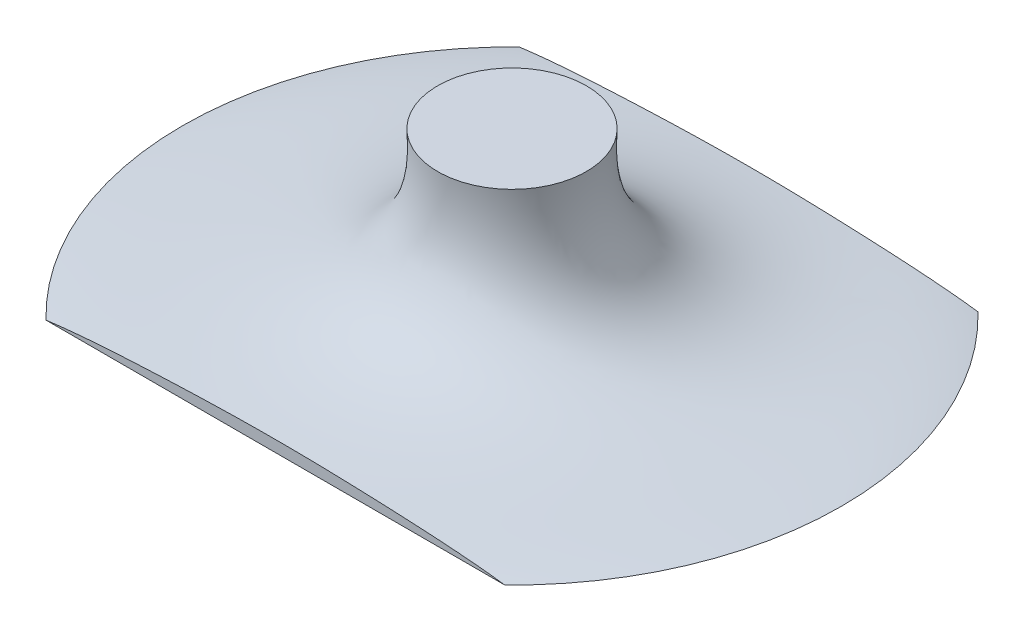
ISO-10303-21;
HEADER;
FILE_DESCRIPTION(('STEP AP214'),'2;1');
FILE_NAME('part.step','',(''),(''),'','','');
FILE_SCHEMA(('AUTOMOTIVE_DESIGN { 1 0 10303 214 1 1 1 1 }'));
ENDSEC;
DATA;
#1=APPLICATION_CONTEXT('core data for automotive mechanical design processes');
#2=APPLICATION_PROTOCOL_DEFINITION('international standard','automotive_design',2000,#1);
#3=PRODUCT_CONTEXT('',#1,'mechanical');
#4=PRODUCT('Part','Part','',(#3));
#5=PRODUCT_RELATED_PRODUCT_CATEGORY('part','',(#4));
#6=PRODUCT_DEFINITION_FORMATION('','',#4);
#7=PRODUCT_DEFINITION_CONTEXT('part definition',#1,'design');
#8=PRODUCT_DEFINITION('design','',#6,#7);
#9=PRODUCT_DEFINITION_SHAPE('','',#8);
#10=(LENGTH_UNIT() NAMED_UNIT(*) SI_UNIT(.MILLI.,.METRE.));
#11=(NAMED_UNIT(*) PLANE_ANGLE_UNIT() SI_UNIT($,.RADIAN.));
#12=(NAMED_UNIT(*) SI_UNIT($,.STERADIAN.) SOLID_ANGLE_UNIT());
#13=UNCERTAINTY_MEASURE_WITH_UNIT(LENGTH_MEASURE(1.E-05),#10,'distance_accuracy_value','');
#14=(GEOMETRIC_REPRESENTATION_CONTEXT(3) GLOBAL_UNCERTAINTY_ASSIGNED_CONTEXT((#13)) GLOBAL_UNIT_ASSIGNED_CONTEXT((#10,
#11,#12)) REPRESENTATION_CONTEXT('',''));
#15=CARTESIAN_POINT('',(0.,0.,0.));
#16=DIRECTION('',(0.,0.,1.));
#17=DIRECTION('',(1.,0.,0.));
#18=AXIS2_PLACEMENT_3D('',#15,#16,#17);
#19=CARTESIAN_POINT('',(97.5,-24.,0.));
#20=CARTESIAN_POINT('',(66.7018546066277,-17.9991049752791,0.));
#21=CARTESIAN_POINT('',(18.6369538432354,-25.1736024500448,0.));
#22=CARTESIAN_POINT('',(22.,24.,0.));
#23=B_SPLINE_CURVE_WITH_KNOTS('',3,(#19,#20,#21,#22),.UNSPECIFIED.,.F.,.F.,(4,4),(0.,1.),.UNSPECIFIED.);
#24=CARTESIAN_POINT('',(0.,-24.,0.));
#25=DIRECTION('',(0.,-1.,0.));
#26=AXIS1_PLACEMENT('',#24,#25);
#27=SURFACE_OF_REVOLUTION('',#23,#26);
#28=CARTESIAN_POINT('',(0.,24.,0.));
#29=DIRECTION('',(0.,-1.,0.));
#30=DIRECTION('',(0.,0.,-1.));
#31=AXIS2_PLACEMENT_3D('',#28,#29,#30);
#32=CIRCLE('',#31,22.);
#33=CARTESIAN_POINT('',(0.,24.,-22.));
#34=VERTEX_POINT('',#33);
#35=EDGE_CURVE('E71',#34,#34,#32,.T.);
#36=ORIENTED_EDGE('',*,*,#35,.T.);
#37=EDGE_LOOP('',(#36));
#38=FACE_BOUND('',#37,.T.);
#39=CARTESIAN_POINT('',(0.,-24.,0.));
#40=DIRECTION('',(0.,-1.,0.));
#41=DIRECTION('',(0.,0.,-1.));
#42=AXIS2_PLACEMENT_3D('',#39,#40,#41);
#43=CIRCLE('',#42,97.5);
#44=CARTESIAN_POINT('',(67.8693598024911,-24.,-70.));
#45=VERTEX_POINT('',#44);
#46=CARTESIAN_POINT('',(67.8693598024911,-24.,70.));
#47=VERTEX_POINT('',#46);
#48=EDGE_CURVE('E74',#45,#47,#43,.T.);
#49=ORIENTED_EDGE('',*,*,#48,.F.);
#50=CARTESIAN_POINT('',(67.8693598024911,-24.,-70.));
#51=CARTESIAN_POINT('',(67.3926945744893,-23.9353546896405,-70.));
#52=CARTESIAN_POINT('',(66.9157333723395,-23.8729283539692,-70.));
#53=CARTESIAN_POINT('',(65.9613033187902,-23.7521398051897,-70.));
#54=CARTESIAN_POINT('',(65.483834475071,-23.6937775314583,-70.));
#55=CARTESIAN_POINT('',(64.0510829729655,-23.5242601371264,-70.));
#56=CARTESIAN_POINT('',(63.0951445171269,-23.4186327921385,-70.));
#57=CARTESIAN_POINT('',(61.1821283855856,-23.2196217463526,-70.));
#58=CARTESIAN_POINT('',(60.2250508652599,-23.1262365341588,-70.));
#59=CARTESIAN_POINT('',(58.3099805806501,-22.9496268840332,-70.));
#60=CARTESIAN_POINT('',(57.3519878322421,-22.8664022729616,-70.));
#61=CARTESIAN_POINT('',(55.4356808607823,-22.7084276172963,-70.));
#62=CARTESIAN_POINT('',(54.4773669042603,-22.6336743162701,-70.));
#63=CARTESIAN_POINT('',(52.5601623294187,-22.4911888008475,-70.));
#64=CARTESIAN_POINT('',(51.6012716799191,-22.4234570084438,-70.));
#65=CARTESIAN_POINT('',(49.6830543859676,-22.2938604311694,-70.));
#66=CARTESIAN_POINT('',(48.7237277244156,-22.231995900788,-70.));
#67=CARTESIAN_POINT('',(46.8047642452785,-22.1132029033477,-70.));
#68=CARTESIAN_POINT('',(45.8451274257939,-22.0562744671175,-70.));
#69=CARTESIAN_POINT('',(43.9255479687257,-21.946612024614,-70.));
#70=CARTESIAN_POINT('',(42.9656053144843,-21.8938783110761,-70.));
#71=CARTESIAN_POINT('',(41.0455563826484,-21.7920474645868,-70.));
#72=CARTESIAN_POINT('',(40.085450110764,-21.7429502236131,-70.));
#73=CARTESIAN_POINT('',(38.1650914256441,-21.6479812911813,-70.));
#74=CARTESIAN_POINT('',(37.2048390145728,-21.6021095558814,-70.));
#75=CARTESIAN_POINT('',(35.2841989040339,-21.5133273733925,-70.));
#76=CARTESIAN_POINT('',(34.3238112047183,-21.4704169229016,-70.));
#77=CARTESIAN_POINT('',(31.4475488879579,-21.3460975892398,-70.));
#78=CARTESIAN_POINT('',(29.5314927984495,-21.2688514537534,-70.));
#79=CARTESIAN_POINT('',(25.6989489556125,-21.1255285923097,-70.));
#80=CARTESIAN_POINT('',(23.7824611992463,-21.059451947571,-70.));
#81=CARTESIAN_POINT('',(19.9489747630972,-20.9397745063728,-70.));
#82=CARTESIAN_POINT('',(18.0319760592306,-20.8861744733705,-70.));
#83=CARTESIAN_POINT('',(14.197631482614,-20.7933533333871,-70.));
#84=CARTESIAN_POINT('',(12.280285610947,-20.7541321822934,-70.));
#85=CARTESIAN_POINT('',(8.44529891626132,-20.6919494654215,-70.));
#86=CARTESIAN_POINT('',(6.52765808947544,-20.6689881282103,-70.));
#87=CARTESIAN_POINT('',(2.69224605107319,-20.6406272958967,-70.));
#88=CARTESIAN_POINT('',(0.774474839713542,-20.6352277671633,-70.));
#89=CARTESIAN_POINT('',(-2.53407788543631,-20.6413233468921,-70.));
#90=CARTESIAN_POINT('',(-3.92486881343926,-20.64858390394,-70.));
#91=CARTESIAN_POINT('',(-6.70637268804592,-20.6722569175297,-70.));
#92=CARTESIAN_POINT('',(-8.0970856346592,-20.6886693729479,-70.));
#93=CARTESIAN_POINT('',(-10.8783702420204,-20.7301638642944,-70.));
#94=CARTESIAN_POINT('',(-12.2689419037537,-20.7552458349186,-70.));
#95=CARTESIAN_POINT('',(-15.0499175842847,-20.8134090103379,-70.));
#96=CARTESIAN_POINT('',(-16.4403216029627,-20.84649022082,-70.));
#97=CARTESIAN_POINT('',(-19.2209167532217,-20.9199063830897,-70.));
#98=CARTESIAN_POINT('',(-20.6111078875821,-20.9602412303303,-70.));
#99=CARTESIAN_POINT('',(-23.3912831516378,-21.0474653675443,-70.));
#100=CARTESIAN_POINT('',(-24.7812672813937,-21.0943546555951,-70.));
#101=CARTESIAN_POINT('',(-27.5609124294475,-21.1941570483622,-70.));
#102=CARTESIAN_POINT('',(-28.9505734643032,-21.2470696933778,-70.));
#103=CARTESIAN_POINT('',(-31.7296653013598,-21.3586816803189,-70.));
#104=CARTESIAN_POINT('',(-33.1190961032525,-21.4173810299268,-70.));
#105=CARTESIAN_POINT('',(-35.437013735959,-21.5202902366886,-70.));
#106=CARTESIAN_POINT('',(-36.3655740403499,-21.5628505398192,-70.));
#107=CARTESIAN_POINT('',(-38.2225589685992,-21.6508151975425,-70.));
#108=CARTESIAN_POINT('',(-39.1509835926494,-21.6962195480737,-70.));
#109=CARTESIAN_POINT('',(-41.0076717440718,-21.7901557521138,-70.));
#110=CARTESIAN_POINT('',(-41.9359352719896,-21.838687594813,-70.));
#111=CARTESIAN_POINT('',(-43.7922141366274,-21.9392882275759,-70.));
#112=CARTESIAN_POINT('',(-44.7202294850825,-21.9913568003996,-70.));
#113=CARTESIAN_POINT('',(-46.5760260837652,-22.0995859971858,-70.));
#114=CARTESIAN_POINT('',(-47.5038073330672,-22.1557466370795,-70.));
#115=CARTESIAN_POINT('',(-49.3590857326912,-22.2728701537785,-70.));
#116=CARTESIAN_POINT('',(-50.2865828772794,-22.3338331218208,-70.));
#117=CARTESIAN_POINT('',(-52.1411670560187,-22.4614442771386,-70.));
#118=CARTESIAN_POINT('',(-53.068254098925,-22.5280923365082,-70.));
#119=CARTESIAN_POINT('',(-54.9219052441265,-22.6681589551821,-70.));
#120=CARTESIAN_POINT('',(-55.8484693541623,-22.7415774114769,-70.));
#121=CARTESIAN_POINT('',(-57.7008846146172,-22.8964968499943,-70.));
#122=CARTESIAN_POINT('',(-58.6267357949745,-22.9779974718049,-70.));
#123=CARTESIAN_POINT('',(-60.4780610703901,-23.1507154684786,-70.));
#124=CARTESIAN_POINT('',(-61.4035346611282,-23.2419382782373,-70.));
#125=CARTESIAN_POINT('',(-63.2533193729688,-23.4359680759102,-70.));
#126=CARTESIAN_POINT('',(-64.1776304438285,-23.5387755482067,-70.));
#127=CARTESIAN_POINT('',(-65.5629461380009,-23.7034031706315,-70.));
#128=CARTESIAN_POINT('',(-66.0245707284596,-23.7600210828488,-70.));
#129=CARTESIAN_POINT('',(-66.9473424795745,-23.8770676267704,-70.));
#130=CARTESIAN_POINT('',(-67.4084896336154,-23.9374963105763,-70.));
#131=CARTESIAN_POINT('',(-67.8693598024911,-24.,-70.));
#132=B_SPLINE_CURVE_WITH_KNOTS('',3,(#50,#51,#52,#53,#54,#55,#56,#57,#58,#59,#60,#61,#62,#63,
#64,#65,#66,#67,#68,#69,#70,#71,#72,#73,#74,#75,#76,#77,#78,#79,#80,#81,#82,#83,#84,#85,#86,#87,
#88,#89,#90,#91,#92,#93,#94,#95,#96,#97,#98,#99,#100,#101,#102,#103,#104,#105,#106,#107,#108,
#109,#110,#111,#112,#113,#114,#115,#116,#117,#118,#119,#120,#121,#122,#123,#124,#125,#126,#127,
#128,#129,#130,#131),.UNSPECIFIED.,.F.,.F.,(4,2,2,2,2,2,2,2,2,2,2,2,2,2,2,2,2,2,2,2,2,2,2,2,2,2,
2,2,2,2,2,2,2,2,2,2,2,2,2,2,4),(0.,1.44307349185828,2.88612545294897,5.77128867268345,
8.65609535827172,11.5408528790093,14.4244976893987,17.3083157065469,20.192258750597,
23.0762198050802,25.9603819450383,28.8444583758311,31.7284955981574,34.612529604662,
40.3653327656773,46.1181777562263,51.8713746770285,57.6245539476639,63.3778140901611,
69.1310632151743,73.3034637575808,77.4758637876728,81.6482323893619,85.8206039573661,
89.9929153936724,94.1652256061048,98.3372176022346,102.509215137067,105.297816909422,
108.086414699418,110.875002851624,113.663419872329,116.451847749464,119.240328615346,
122.028746761158,124.817122489009,127.605373929298,130.395192315295,133.185127393544,
134.580364359671,135.97562040589),.UNSPECIFIED.);
#133=CARTESIAN_POINT('',(-67.8693598024911,-24.,-70.));
#134=VERTEX_POINT('',#133);
#135=EDGE_CURVE('E61',#45,#134,#132,.T.);
#136=ORIENTED_EDGE('',*,*,#135,.T.);
#137=CARTESIAN_POINT('',(-67.8693598024911,-24.,70.));
#138=VERTEX_POINT('',#137);
#139=EDGE_CURVE('E75',#138,#134,#43,.T.);
#140=ORIENTED_EDGE('',*,*,#139,.F.);
#141=CARTESIAN_POINT('',(67.8693598024911,-24.,70.));
#142=CARTESIAN_POINT('',(67.3926945744893,-23.9353546896405,70.));
#143=CARTESIAN_POINT('',(66.9157333723395,-23.8729283539692,70.));
#144=CARTESIAN_POINT('',(65.9613033187902,-23.7521398051897,70.));
#145=CARTESIAN_POINT('',(65.483834475071,-23.6937775314583,70.));
#146=CARTESIAN_POINT('',(64.0510829729655,-23.5242601371264,70.));
#147=CARTESIAN_POINT('',(63.0951445171269,-23.4186327921385,70.));
#148=CARTESIAN_POINT('',(61.1821283855856,-23.2196217463526,70.));
#149=CARTESIAN_POINT('',(60.2250508652599,-23.1262365341588,70.));
#150=CARTESIAN_POINT('',(58.30998058065,-22.9496268840332,70.));
#151=CARTESIAN_POINT('',(57.3519878322421,-22.8664022729616,70.));
#152=CARTESIAN_POINT('',(55.4356808607823,-22.7084276172963,70.));
#153=CARTESIAN_POINT('',(54.4773669042603,-22.6336743162701,70.));
#154=CARTESIAN_POINT('',(52.5601623294186,-22.4911888008475,70.));
#155=CARTESIAN_POINT('',(51.6012716799191,-22.4234570084438,70.));
#156=CARTESIAN_POINT('',(49.6830543859675,-22.2938604311694,70.));
#157=CARTESIAN_POINT('',(48.7237277244155,-22.231995900788,70.));
#158=CARTESIAN_POINT('',(46.8047642452785,-22.1132029033478,70.));
#159=CARTESIAN_POINT('',(45.8451274257939,-22.0562744671175,70.));
#160=CARTESIAN_POINT('',(43.9255479687257,-21.946612024614,70.));
#161=CARTESIAN_POINT('',(42.9656053144843,-21.893878311076,70.));
#162=CARTESIAN_POINT('',(41.0455563826484,-21.7920474645868,70.));
#163=CARTESIAN_POINT('',(40.085450110764,-21.7429502236131,70.));
#164=CARTESIAN_POINT('',(38.1650914256441,-21.6479812911813,70.));
#165=CARTESIAN_POINT('',(37.2048390145728,-21.6021095558814,70.));
#166=CARTESIAN_POINT('',(35.2841989040339,-21.5133273733925,70.));
#167=CARTESIAN_POINT('',(34.3238112047183,-21.4704169229016,70.));
#168=CARTESIAN_POINT('',(31.4475488879579,-21.3460975892398,70.));
#169=CARTESIAN_POINT('',(29.5314927984495,-21.2688514537534,70.));
#170=CARTESIAN_POINT('',(25.6989489556124,-21.1255285923097,70.));
#171=CARTESIAN_POINT('',(23.7824611992463,-21.059451947571,70.));
#172=CARTESIAN_POINT('',(19.9489747630971,-20.9397745063728,70.));
#173=CARTESIAN_POINT('',(18.0319760592306,-20.8861744733705,70.));
#174=CARTESIAN_POINT('',(14.1976314826139,-20.7933533333871,70.));
#175=CARTESIAN_POINT('',(12.2802856109469,-20.7541321822934,70.));
#176=CARTESIAN_POINT('',(8.4452989162613,-20.6919494654215,70.));
#177=CARTESIAN_POINT('',(6.52765808947542,-20.6689881282103,70.));
#178=CARTESIAN_POINT('',(2.69224605107317,-20.6406272958967,70.));
#179=CARTESIAN_POINT('',(0.774474839713514,-20.6352277671633,70.));
#180=CARTESIAN_POINT('',(-2.53407788543634,-20.6413233468921,70.));
#181=CARTESIAN_POINT('',(-3.92486881343928,-20.64858390394,70.));
#182=CARTESIAN_POINT('',(-6.70637268804595,-20.6722569175297,70.));
#183=CARTESIAN_POINT('',(-8.09708563465922,-20.6886693729479,70.));
#184=CARTESIAN_POINT('',(-10.8783702420204,-20.7301638642944,70.));
#185=CARTESIAN_POINT('',(-12.2689419037537,-20.7552458349186,70.));
#186=CARTESIAN_POINT('',(-15.0499175842848,-20.8134090103379,70.));
#187=CARTESIAN_POINT('',(-16.4403216029627,-20.8464902208201,70.));
#188=CARTESIAN_POINT('',(-19.2209167532217,-20.9199063830897,70.));
#189=CARTESIAN_POINT('',(-20.6111078875821,-20.9602412303303,70.));
#190=CARTESIAN_POINT('',(-23.3912831516378,-21.0474653675443,70.));
#191=CARTESIAN_POINT('',(-24.7812672813937,-21.0943546555951,70.));
#192=CARTESIAN_POINT('',(-27.5609124294475,-21.1941570483622,70.));
#193=CARTESIAN_POINT('',(-28.9505734643032,-21.2470696933778,70.));
#194=CARTESIAN_POINT('',(-31.7296653013598,-21.3586816803189,70.));
#195=CARTESIAN_POINT('',(-33.1190961032525,-21.4173810299268,70.));
#196=CARTESIAN_POINT('',(-35.437013735959,-21.5202902366886,70.));
#197=CARTESIAN_POINT('',(-36.3655740403499,-21.5628505398192,70.));
#198=CARTESIAN_POINT('',(-38.2225589685992,-21.6508151975425,70.));
#199=CARTESIAN_POINT('',(-39.1509835926494,-21.6962195480737,70.));
#200=CARTESIAN_POINT('',(-41.0076717440718,-21.7901557521138,70.));
#201=CARTESIAN_POINT('',(-41.9359352719896,-21.838687594813,70.));
#202=CARTESIAN_POINT('',(-43.7922141366274,-21.9392882275759,70.));
#203=CARTESIAN_POINT('',(-44.7202294850825,-21.9913568003996,70.));
#204=CARTESIAN_POINT('',(-46.5760260837652,-22.0995859971858,70.));
#205=CARTESIAN_POINT('',(-47.5038073330672,-22.1557466370795,70.));
#206=CARTESIAN_POINT('',(-49.3590857326912,-22.2728701537785,70.));
#207=CARTESIAN_POINT('',(-50.2865828772794,-22.3338331218208,70.));
#208=CARTESIAN_POINT('',(-52.1411670560187,-22.4614442771386,70.));
#209=CARTESIAN_POINT('',(-53.068254098925,-22.5280923365082,70.));
#210=CARTESIAN_POINT('',(-54.9219052441265,-22.6681589551821,70.));
#211=CARTESIAN_POINT('',(-55.8484693541623,-22.7415774114769,70.));
#212=CARTESIAN_POINT('',(-57.7008846146172,-22.8964968499943,70.));
#213=CARTESIAN_POINT('',(-58.6267357949745,-22.9779974718049,70.));
#214=CARTESIAN_POINT('',(-60.4780610703901,-23.1507154684786,70.));
#215=CARTESIAN_POINT('',(-61.4035346611282,-23.2419382782373,70.));
#216=CARTESIAN_POINT('',(-63.2533193729688,-23.4359680759102,70.));
#217=CARTESIAN_POINT('',(-64.1776304438285,-23.5387755482067,70.));
#218=CARTESIAN_POINT('',(-65.5629461380009,-23.7034031706315,70.));
#219=CARTESIAN_POINT('',(-66.0245707284596,-23.7600210828488,70.));
#220=CARTESIAN_POINT('',(-66.9473424795745,-23.8770676267704,70.));
#221=CARTESIAN_POINT('',(-67.4084896336154,-23.9374963105763,70.));
#222=CARTESIAN_POINT('',(-67.8693598024911,-24.,70.));
#223=B_SPLINE_CURVE_WITH_KNOTS('',3,(#141,#142,#143,#144,#145,#146,#147,#148,#149,#150,#151,
#152,#153,#154,#155,#156,#157,#158,#159,#160,#161,#162,#163,#164,#165,#166,#167,#168,#169,#170,
#171,#172,#173,#174,#175,#176,#177,#178,#179,#180,#181,#182,#183,#184,#185,#186,#187,#188,#189,
#190,#191,#192,#193,#194,#195,#196,#197,#198,#199,#200,#201,#202,#203,#204,#205,#206,#207,#208,
#209,#210,#211,#212,#213,#214,#215,#216,#217,#218,#219,#220,#221,#222),.UNSPECIFIED.,.F.,.F.,(4,
2,2,2,2,2,2,2,2,2,2,2,2,2,2,2,2,2,2,2,2,2,2,2,2,2,2,2,2,2,2,2,2,2,2,2,2,2,2,2,4),(0.,
1.44307349185828,2.88612545294899,5.77128867268345,8.65609535827173,11.5408528790093,
14.4244976893987,17.3083157065469,20.192258750597,23.0762198050802,25.9603819450383,
28.8444583758311,31.7284955981574,34.6125296046621,40.3653327656773,46.1181777562263,
51.8713746770285,57.6245539476639,63.3778140901611,69.1310632151744,73.3034637575809,
77.4758637876728,81.6482323893619,85.8206039573661,89.9929153936725,94.1652256061048,
98.3372176022346,102.509215137067,105.297816909422,108.086414699418,110.875002851624,
113.663419872329,116.451847749464,119.240328615346,122.028746761158,124.817122489009,
127.605373929298,130.395192315295,133.185127393544,134.580364359671,135.97562040589),.UNSPECIFIED.);
#224=EDGE_CURVE('E54',#47,#138,#223,.T.);
#225=ORIENTED_EDGE('',*,*,#224,.F.);
#226=EDGE_LOOP('',(#49,#136,#140,#225));
#227=FACE_BOUND('',#226,.T.);
#228=ADVANCED_FACE('F39',(#38,#227),#27,.F.);
#229=CARTESIAN_POINT('',(0.,-24.,0.));
#230=DIRECTION('',(0.,-1.,0.));
#231=DIRECTION('',(0.,0.,-1.));
#232=AXIS2_PLACEMENT_3D('',#229,#230,#231);
#233=PLANE('',#232);
#234=ORIENTED_EDGE('',*,*,#139,.T.);
#235=DIRECTION('',(1.,0.,0.));
#236=VECTOR('',#235,1.);
#237=CARTESIAN_POINT('',(0.,-24.,-70.));
#238=LINE('',#237,#236);
#239=EDGE_CURVE('E11',#134,#45,#238,.T.);
#240=ORIENTED_EDGE('',*,*,#239,.T.);
#241=ORIENTED_EDGE('',*,*,#48,.T.);
#242=DIRECTION('',(1.,0.,0.));
#243=VECTOR('',#242,1.);
#244=CARTESIAN_POINT('',(0.,-24.,70.));
#245=LINE('',#244,#243);
#246=EDGE_CURVE('E48',#138,#47,#245,.T.);
#247=ORIENTED_EDGE('',*,*,#246,.F.);
#248=EDGE_LOOP('',(#234,#240,#241,#247));
#249=FACE_BOUND('',#248,.T.);
#250=ADVANCED_FACE('F78',(#249),#233,.T.);
#251=CARTESIAN_POINT('',(0.,24.,0.));
#252=DIRECTION('',(0.,1.,0.));
#253=DIRECTION('',(0.,0.,1.));
#254=AXIS2_PLACEMENT_3D('',#251,#252,#253);
#255=PLANE('',#254);
#256=ORIENTED_EDGE('',*,*,#35,.F.);
#257=EDGE_LOOP('',(#256));
#258=FACE_BOUND('',#257,.T.);
#259=ADVANCED_FACE('F41',(#258),#255,.T.);
#260=CARTESIAN_POINT('',(0.,24.000012,70.));
#261=DIRECTION('',(0.,0.,-1.));
#262=DIRECTION('',(-1.,0.,0.));
#263=AXIS2_PLACEMENT_3D('',#260,#261,#262);
#264=PLANE('',#263);
#265=ORIENTED_EDGE('',*,*,#224,.T.);
#266=ORIENTED_EDGE('',*,*,#246,.T.);
#267=EDGE_LOOP('',(#265,#266));
#268=FACE_BOUND('',#267,.T.);
#269=ADVANCED_FACE('F65',(#268),#264,.F.);
#270=CARTESIAN_POINT('',(0.,24.000012,-70.));
#271=DIRECTION('',(0.,0.,-1.));
#272=DIRECTION('',(-1.,0.,0.));
#273=AXIS2_PLACEMENT_3D('',#270,#271,#272);
#274=PLANE('',#273);
#275=ORIENTED_EDGE('',*,*,#239,.F.);
#276=ORIENTED_EDGE('',*,*,#135,.F.);
#277=EDGE_LOOP('',(#275,#276));
#278=FACE_BOUND('',#277,.T.);
#279=ADVANCED_FACE('F110',(#278),#274,.T.);
#280=CLOSED_SHELL('',(#228,#250,#259,#269,#279));
#281=MANIFOLD_SOLID_BREP('B2',#280);
#282=ADVANCED_BREP_SHAPE_REPRESENTATION('',(#18,#281),#14);
#283=SHAPE_DEFINITION_REPRESENTATION(#9,#282);
ENDSEC;
END-ISO-10303-21;
